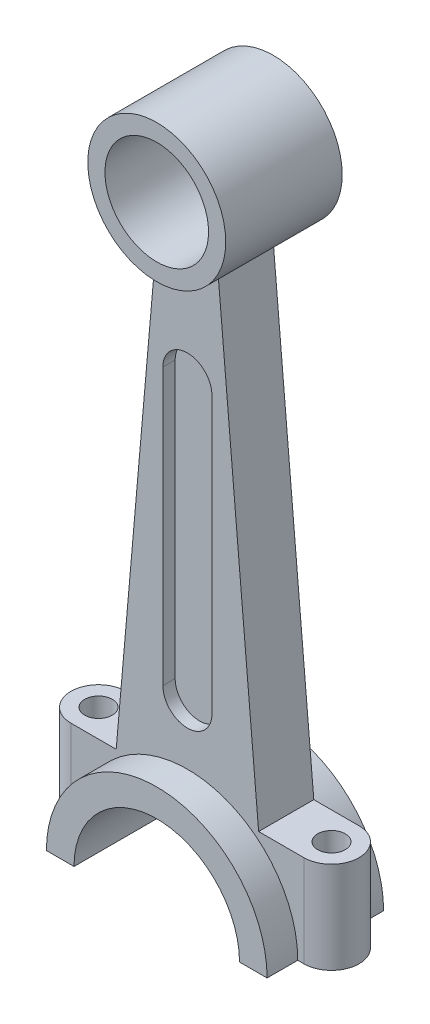
ISO-10303-21;
HEADER;
FILE_DESCRIPTION(('STEP AP214'),'2;1');
FILE_NAME('part.step','',(''),(''),'','','');
FILE_SCHEMA(('AUTOMOTIVE_DESIGN { 1 0 10303 214 1 1 1 1 }'));
ENDSEC;
DATA;
#1=APPLICATION_CONTEXT('core data for automotive mechanical design processes');
#2=APPLICATION_PROTOCOL_DEFINITION('international standard','automotive_design',2000,#1);
#3=PRODUCT_CONTEXT('',#1,'mechanical');
#4=PRODUCT('Part','Part','',(#3));
#5=PRODUCT_RELATED_PRODUCT_CATEGORY('part','',(#4));
#6=PRODUCT_DEFINITION_FORMATION('','',#4);
#7=PRODUCT_DEFINITION_CONTEXT('part definition',#1,'design');
#8=PRODUCT_DEFINITION('design','',#6,#7);
#9=PRODUCT_DEFINITION_SHAPE('','',#8);
#10=(LENGTH_UNIT() NAMED_UNIT(*) SI_UNIT(.MILLI.,.METRE.));
#11=(NAMED_UNIT(*) PLANE_ANGLE_UNIT() SI_UNIT($,.RADIAN.));
#12=(NAMED_UNIT(*) SI_UNIT($,.STERADIAN.) SOLID_ANGLE_UNIT());
#13=UNCERTAINTY_MEASURE_WITH_UNIT(LENGTH_MEASURE(1.E-05),#10,'distance_accuracy_value','');
#14=(GEOMETRIC_REPRESENTATION_CONTEXT(3) GLOBAL_UNCERTAINTY_ASSIGNED_CONTEXT((#13)) GLOBAL_UNIT_ASSIGNED_CONTEXT((#10,
#11,#12)) REPRESENTATION_CONTEXT('',''));
#15=CARTESIAN_POINT('',(0.,0.,0.));
#16=DIRECTION('',(0.,0.,1.));
#17=DIRECTION('',(1.,0.,0.));
#18=AXIS2_PLACEMENT_3D('',#15,#16,#17);
#19=CARTESIAN_POINT('',(0.,-201.2,-80.));
#20=DIRECTION('',(0.,1.,0.));
#21=DIRECTION('',(0.,0.,1.));
#22=AXIS2_PLACEMENT_3D('',#19,#20,#21);
#23=PLANE('',#22);
#24=CARTESIAN_POINT('',(-38.,-201.2,0.));
#25=DIRECTION('',(0.,1.,0.));
#26=DIRECTION('',(0.,0.,1.));
#27=AXIS2_PLACEMENT_3D('',#24,#25,#26);
#28=CIRCLE('',#27,4.5);
#29=CARTESIAN_POINT('',(-38.,-201.2,4.50000000000001));
#30=VERTEX_POINT('',#29);
#31=EDGE_CURVE('E745',#30,#30,#28,.F.);
#32=ORIENTED_EDGE('',*,*,#31,.F.);
#33=EDGE_LOOP('',(#32));
#34=FACE_BOUND('',#33,.T.);
#35=DIRECTION('',(0.,0.,-1.));
#36=VECTOR('',#35,1.);
#37=CARTESIAN_POINT('',(-27.,-201.2,19.));
#38=LINE('',#37,#36);
#39=CARTESIAN_POINT('',(-27.,-201.2,-19.));
#40=VERTEX_POINT('',#39);
#41=CARTESIAN_POINT('',(-27.,-201.2,19.));
#42=VERTEX_POINT('',#41);
#43=EDGE_CURVE('E268',#40,#42,#38,.F.);
#44=ORIENTED_EDGE('',*,*,#43,.T.);
#45=DIRECTION('',(-1.,0.,0.));
#46=VECTOR('',#45,1.);
#47=CARTESIAN_POINT('',(0.,-201.2,19.));
#48=LINE('',#47,#46);
#49=CARTESIAN_POINT('',(-36.,-201.2,19.));
#50=VERTEX_POINT('',#49);
#51=EDGE_CURVE('E259',#42,#50,#48,.T.);
#52=ORIENTED_EDGE('',*,*,#51,.T.);
#53=DIRECTION('',(0.,0.,-1.));
#54=VECTOR('',#53,1.);
#55=CARTESIAN_POINT('',(-36.,-201.2,19.));
#56=LINE('',#55,#54);
#57=CARTESIAN_POINT('',(-36.,-201.2,8.99999999999997));
#58=VERTEX_POINT('',#57);
#59=EDGE_CURVE('E269',#58,#50,#56,.F.);
#60=ORIENTED_EDGE('',*,*,#59,.F.);
#61=DIRECTION('',(1.,0.,0.));
#62=VECTOR('',#61,1.);
#63=CARTESIAN_POINT('',(-38.,-201.2,8.99999999999997));
#64=LINE('',#63,#62);
#65=CARTESIAN_POINT('',(-38.,-201.2,8.99999999999997));
#66=VERTEX_POINT('',#65);
#67=EDGE_CURVE('E250',#66,#58,#64,.T.);
#68=ORIENTED_EDGE('',*,*,#67,.F.);
#69=CARTESIAN_POINT('',(-38.,-201.2,0.));
#70=DIRECTION('',(0.,1.,0.));
#71=DIRECTION('',(0.,0.,1.));
#72=AXIS2_PLACEMENT_3D('',#69,#70,#71);
#73=CIRCLE('',#72,8.99999999999999);
#74=CARTESIAN_POINT('',(-38.,-201.2,-9.));
#75=VERTEX_POINT('',#74);
#76=EDGE_CURVE('E231',#75,#66,#73,.T.);
#77=ORIENTED_EDGE('',*,*,#76,.F.);
#78=DIRECTION('',(-1.,0.,0.));
#79=VECTOR('',#78,1.);
#80=CARTESIAN_POINT('',(-38.,-201.2,-9.));
#81=LINE('',#80,#79);
#82=CARTESIAN_POINT('',(-36.,-201.2,-9.00000000000001));
#83=VERTEX_POINT('',#82);
#84=EDGE_CURVE('E199',#83,#75,#81,.T.);
#85=ORIENTED_EDGE('',*,*,#84,.F.);
#86=CARTESIAN_POINT('',(-36.,-201.2,-19.));
#87=VERTEX_POINT('',#86);
#88=EDGE_CURVE('E264',#87,#83,#56,.F.);
#89=ORIENTED_EDGE('',*,*,#88,.F.);
#90=DIRECTION('',(-1.,0.,0.));
#91=VECTOR('',#90,1.);
#92=CARTESIAN_POINT('',(0.,-201.2,-19.));
#93=LINE('',#92,#91);
#94=EDGE_CURVE('E45',#40,#87,#93,.T.);
#95=ORIENTED_EDGE('',*,*,#94,.F.);
#96=EDGE_LOOP('',(#44,#52,#60,#68,#77,#85,#89,#95));
#97=FACE_BOUND('',#96,.T.);
#98=ADVANCED_FACE('F41',(#34,#97),#23,.F.);
#99=CARTESIAN_POINT('',(8.17146237229209,0.715894802816536,9.));
#100=DIRECTION('',(0.996184270499604,0.0872748486631294,0.));
#101=DIRECTION('',(-0.0872748486631294,0.996184270499604,0.));
#102=AXIS2_PLACEMENT_3D('',#99,#100,#101);
#103=PLANE('',#102);
#104=DIRECTION('',(0.0872748486631294,-0.996184270499604,0.));
#105=VECTOR('',#104,1.);
#106=CARTESIAN_POINT('',(8.17146237229209,0.715894802816536,9.));
#107=LINE('',#106,#105);
#108=CARTESIAN_POINT('',(10.,-20.1556443707464,9.));
#109=VERTEX_POINT('',#108);
#110=CARTESIAN_POINT('',(23.2328663173449,-171.2,9.));
#111=VERTEX_POINT('',#110);
#112=EDGE_CURVE('E387',#109,#111,#107,.T.);
#113=ORIENTED_EDGE('',*,*,#112,.T.);
#114=DIRECTION('',(0.,0.,-1.));
#115=VECTOR('',#114,1.);
#116=CARTESIAN_POINT('',(23.2328663173449,-171.2,9.));
#117=LINE('',#116,#115);
#118=CARTESIAN_POINT('',(23.2328663173449,-171.2,-9.));
#119=VERTEX_POINT('',#118);
#120=EDGE_CURVE('E57',#111,#119,#117,.T.);
#121=ORIENTED_EDGE('',*,*,#120,.T.);
#122=DIRECTION('',(0.0872748486631294,-0.996184270499604,0.));
#123=VECTOR('',#122,1.);
#124=CARTESIAN_POINT('',(8.17146237229209,0.715894802816536,-9.));
#125=LINE('',#124,#123);
#126=CARTESIAN_POINT('',(10.,-20.1556443707464,-9.));
#127=VERTEX_POINT('',#126);
#128=EDGE_CURVE('E400',#127,#119,#125,.T.);
#129=ORIENTED_EDGE('',*,*,#128,.F.);
#130=DIRECTION('',(0.,0.,-1.));
#131=VECTOR('',#130,1.);
#132=CARTESIAN_POINT('',(10.,-20.1556443707464,9.));
#133=LINE('',#132,#131);
#134=EDGE_CURVE('E411',#109,#127,#133,.T.);
#135=ORIENTED_EDGE('',*,*,#134,.F.);
#136=EDGE_LOOP('',(#113,#121,#129,#135));
#137=FACE_BOUND('',#136,.T.);
#138=ADVANCED_FACE('F445',(#137),#103,.T.);
#139=CARTESIAN_POINT('',(-8.17146237229209,0.715894802816535,9.));
#140=DIRECTION('',(0.996184270499604,-0.0872748486631293,0.));
#141=DIRECTION('',(0.0872748486631293,0.996184270499604,0.));
#142=AXIS2_PLACEMENT_3D('',#139,#140,#141);
#143=PLANE('',#142);
#144=DIRECTION('',(0.,0.,-1.));
#145=VECTOR('',#144,1.);
#146=CARTESIAN_POINT('',(-23.2328663173449,-171.2,9.));
#147=LINE('',#146,#145);
#148=CARTESIAN_POINT('',(-23.2328663173449,-171.2,9.));
#149=VERTEX_POINT('',#148);
#150=CARTESIAN_POINT('',(-23.2328663173449,-171.2,-9.));
#151=VERTEX_POINT('',#150);
#152=EDGE_CURVE('E213',#149,#151,#147,.T.);
#153=ORIENTED_EDGE('',*,*,#152,.F.);
#154=DIRECTION('',(-0.0872748486631293,-0.996184270499604,0.));
#155=VECTOR('',#154,1.);
#156=CARTESIAN_POINT('',(-8.17146237229209,0.715894802816535,9.));
#157=LINE('',#156,#155);
#158=CARTESIAN_POINT('',(-10.,-20.1556443707464,9.));
#159=VERTEX_POINT('',#158);
#160=EDGE_CURVE('E393',#159,#149,#157,.T.);
#161=ORIENTED_EDGE('',*,*,#160,.F.);
#162=DIRECTION('',(0.,0.,-1.));
#163=VECTOR('',#162,1.);
#164=CARTESIAN_POINT('',(-10.,-20.1556443707464,9.));
#165=LINE('',#164,#163);
#166=CARTESIAN_POINT('',(-10.,-20.1556443707464,-9.));
#167=VERTEX_POINT('',#166);
#168=EDGE_CURVE('E397',#159,#167,#165,.T.);
#169=ORIENTED_EDGE('',*,*,#168,.T.);
#170=DIRECTION('',(-0.0872748486631293,-0.996184270499604,0.));
#171=VECTOR('',#170,1.);
#172=CARTESIAN_POINT('',(-8.17146237229209,0.715894802816535,-9.));
#173=LINE('',#172,#171);
#174=EDGE_CURVE('E65',#167,#151,#173,.T.);
#175=ORIENTED_EDGE('',*,*,#174,.T.);
#176=EDGE_LOOP('',(#153,#161,#169,#175));
#177=FACE_BOUND('',#176,.T.);
#178=ADVANCED_FACE('F452',(#177),#143,.F.);
#179=CARTESIAN_POINT('',(0.,-201.2,19.));
#180=DIRECTION('',(0.,0.,-1.));
#181=DIRECTION('',(-1.,0.,0.));
#182=AXIS2_PLACEMENT_3D('',#179,#180,#181);
#183=CYLINDRICAL_SURFACE('',#182,27.);
#184=CARTESIAN_POINT('',(0.,-201.2,-19.));
#185=DIRECTION('',(0.,0.,1.));
#186=DIRECTION('',(1.,0.,0.));
#187=AXIS2_PLACEMENT_3D('',#184,#185,#186);
#188=CIRCLE('',#187,27.);
#189=CARTESIAN_POINT('',(27.,-201.2,-19.));
#190=VERTEX_POINT('',#189);
#191=EDGE_CURVE('E358',#190,#40,#188,.T.);
#192=ORIENTED_EDGE('',*,*,#191,.F.);
#193=DIRECTION('',(0.,0.,-1.));
#194=VECTOR('',#193,1.);
#195=CARTESIAN_POINT('',(27.,-201.2,19.));
#196=LINE('',#195,#194);
#197=CARTESIAN_POINT('',(27.,-201.2,19.));
#198=VERTEX_POINT('',#197);
#199=EDGE_CURVE('E277',#198,#190,#196,.T.);
#200=ORIENTED_EDGE('',*,*,#199,.F.);
#201=CARTESIAN_POINT('',(0.,-201.2,19.));
#202=DIRECTION('',(0.,0.,1.));
#203=DIRECTION('',(1.,0.,0.));
#204=AXIS2_PLACEMENT_3D('',#201,#202,#203);
#205=CIRCLE('',#204,27.);
#206=EDGE_CURVE('E368',#198,#42,#205,.T.);
#207=ORIENTED_EDGE('',*,*,#206,.T.);
#208=ORIENTED_EDGE('',*,*,#43,.F.);
#209=EDGE_LOOP('',(#192,#200,#207,#208));
#210=FACE_BOUND('',#209,.T.);
#211=ADVANCED_FACE('F481',(#210),#183,.F.);
#212=CARTESIAN_POINT('',(0.,-201.2,19.));
#213=DIRECTION('',(0.,0.,-1.));
#214=DIRECTION('',(-1.,0.,0.));
#215=AXIS2_PLACEMENT_3D('',#212,#213,#214);
#216=CYLINDRICAL_SURFACE('',#215,36.);
#217=CARTESIAN_POINT('',(0.,-201.2,9.));
#218=DIRECTION('',(0.,0.,1.));
#219=DIRECTION('',(1.,0.,0.));
#220=AXIS2_PLACEMENT_3D('',#217,#218,#219);
#221=CIRCLE('',#220,36.);
#222=CARTESIAN_POINT('',(36.,-201.2,9.00000000000001));
#223=VERTEX_POINT('',#222);
#224=EDGE_CURVE('E384',#223,#58,#221,.T.);
#225=ORIENTED_EDGE('',*,*,#224,.T.);
#226=ORIENTED_EDGE('',*,*,#59,.T.);
#227=CARTESIAN_POINT('',(0.,-201.2,19.));
#228=DIRECTION('',(0.,0.,1.));
#229=DIRECTION('',(1.,0.,0.));
#230=AXIS2_PLACEMENT_3D('',#227,#228,#229);
#231=CIRCLE('',#230,36.);
#232=CARTESIAN_POINT('',(36.,-201.2,19.));
#233=VERTEX_POINT('',#232);
#234=EDGE_CURVE('E372',#233,#50,#231,.T.);
#235=ORIENTED_EDGE('',*,*,#234,.F.);
#236=DIRECTION('',(0.,0.,-1.));
#237=VECTOR('',#236,1.);
#238=CARTESIAN_POINT('',(36.,-201.2,19.));
#239=LINE('',#238,#237);
#240=EDGE_CURVE('E273',#233,#223,#239,.T.);
#241=ORIENTED_EDGE('',*,*,#240,.T.);
#242=EDGE_LOOP('',(#225,#226,#235,#241));
#243=FACE_BOUND('',#242,.T.);
#244=ADVANCED_FACE('F488',(#243),#216,.T.);
#245=CARTESIAN_POINT('',(0.,-201.2,-9.));
#246=DIRECTION('',(0.,0.,1.));
#247=DIRECTION('',(1.,0.,0.));
#248=AXIS2_PLACEMENT_3D('',#245,#246,#247);
#249=CIRCLE('',#248,36.);
#250=CARTESIAN_POINT('',(36.,-201.2,-8.99999999999998));
#251=VERTEX_POINT('',#250);
#252=EDGE_CURVE('E377',#251,#83,#249,.T.);
#253=ORIENTED_EDGE('',*,*,#252,.F.);
#254=CARTESIAN_POINT('',(36.,-201.2,-19.));
#255=VERTEX_POINT('',#254);
#256=EDGE_CURVE('E272',#251,#255,#239,.T.);
#257=ORIENTED_EDGE('',*,*,#256,.T.);
#258=CARTESIAN_POINT('',(0.,-201.2,-19.));
#259=DIRECTION('',(0.,0.,1.));
#260=DIRECTION('',(1.,0.,0.));
#261=AXIS2_PLACEMENT_3D('',#258,#259,#260);
#262=CIRCLE('',#261,36.);
#263=EDGE_CURVE('E373',#255,#87,#262,.T.);
#264=ORIENTED_EDGE('',*,*,#263,.T.);
#265=ORIENTED_EDGE('',*,*,#88,.T.);
#266=EDGE_LOOP('',(#253,#257,#264,#265));
#267=FACE_BOUND('',#266,.T.);
#268=ADVANCED_FACE('F522',(#267),#216,.T.);
#269=CARTESIAN_POINT('',(0.,0.,-9.));
#270=DIRECTION('',(0.,0.,1.));
#271=DIRECTION('',(1.,0.,0.));
#272=AXIS2_PLACEMENT_3D('',#269,#270,#271);
#273=PLANE('',#272);
#274=ORIENTED_EDGE('',*,*,#252,.T.);
#275=ORIENTED_EDGE('',*,*,#84,.T.);
#276=DIRECTION('',(0.,1.,0.));
#277=VECTOR('',#276,1.);
#278=CARTESIAN_POINT('',(-38.,-296.907888912043,-9.));
#279=LINE('',#278,#277);
#280=CARTESIAN_POINT('',(-38.,-171.2,-9.));
#281=VERTEX_POINT('',#280);
#282=EDGE_CURVE('E193',#75,#281,#279,.T.);
#283=ORIENTED_EDGE('',*,*,#282,.T.);
#284=DIRECTION('',(1.,0.,0.));
#285=VECTOR('',#284,1.);
#286=CARTESIAN_POINT('',(-38.,-171.2,-9.));
#287=LINE('',#286,#285);
#288=EDGE_CURVE('E197',#281,#151,#287,.T.);
#289=ORIENTED_EDGE('',*,*,#288,.T.);
#290=ORIENTED_EDGE('',*,*,#174,.F.);
#291=CARTESIAN_POINT('',(0.,0.,-9.));
#292=DIRECTION('',(0.,0.,1.));
#293=DIRECTION('',(1.,0.,0.));
#294=AXIS2_PLACEMENT_3D('',#291,#292,#293);
#295=CIRCLE('',#294,22.5);
#296=EDGE_CURVE('E403',#167,#127,#295,.T.);
#297=ORIENTED_EDGE('',*,*,#296,.T.);
#298=ORIENTED_EDGE('',*,*,#128,.T.);
#299=CARTESIAN_POINT('',(38.,-171.2,-8.99999999999998));
#300=VERTEX_POINT('',#299);
#301=EDGE_CURVE('E216',#119,#300,#287,.T.);
#302=ORIENTED_EDGE('',*,*,#301,.T.);
#303=DIRECTION('',(0.,1.,0.));
#304=VECTOR('',#303,1.);
#305=CARTESIAN_POINT('',(38.,-296.907888912043,-8.99999999999998));
#306=LINE('',#305,#304);
#307=CARTESIAN_POINT('',(38.,-201.2,-8.99999999999998));
#308=VERTEX_POINT('',#307);
#309=EDGE_CURVE('E206',#308,#300,#306,.T.);
#310=ORIENTED_EDGE('',*,*,#309,.F.);
#311=EDGE_CURVE('E494',#308,#251,#81,.T.);
#312=ORIENTED_EDGE('',*,*,#311,.T.);
#313=EDGE_LOOP('',(#274,#275,#283,#289,#290,#297,#298,#302,#310,#312));
#314=FACE_BOUND('',#313,.T.);
#315=CARTESIAN_POINT('',(0.,-55.6,-9.));
#316=DIRECTION('',(0.,0.,1.));
#317=DIRECTION('',(1.,0.,0.));
#318=AXIS2_PLACEMENT_3D('',#315,#316,#317);
#319=CIRCLE('',#318,7.99999999999998);
#320=CARTESIAN_POINT('',(7.99999999999997,-55.6,-9.));
#321=VERTEX_POINT('',#320);
#322=CARTESIAN_POINT('',(-7.99999999999999,-55.6,-9.));
#323=VERTEX_POINT('',#322);
#324=EDGE_CURVE('E280',#321,#323,#319,.T.);
#325=ORIENTED_EDGE('',*,*,#324,.T.);
#326=DIRECTION('',(0.,-1.,0.));
#327=VECTOR('',#326,1.);
#328=CARTESIAN_POINT('',(-7.99999999999999,-55.6,-9.));
#329=LINE('',#328,#327);
#330=CARTESIAN_POINT('',(-7.99999999999997,-145.6,-9.));
#331=VERTEX_POINT('',#330);
#332=EDGE_CURVE('E286',#323,#331,#329,.T.);
#333=ORIENTED_EDGE('',*,*,#332,.T.);
#334=CARTESIAN_POINT('',(0.,-145.6,-9.));
#335=DIRECTION('',(0.,0.,1.));
#336=DIRECTION('',(1.,0.,0.));
#337=AXIS2_PLACEMENT_3D('',#334,#335,#336);
#338=CIRCLE('',#337,7.99999999999998);
#339=CARTESIAN_POINT('',(8.,-145.6,-9.));
#340=VERTEX_POINT('',#339);
#341=EDGE_CURVE('E303',#331,#340,#338,.T.);
#342=ORIENTED_EDGE('',*,*,#341,.T.);
#343=DIRECTION('',(0.,1.,0.));
#344=VECTOR('',#343,1.);
#345=CARTESIAN_POINT('',(7.99999999999997,-55.6,-9.));
#346=LINE('',#345,#344);
#347=EDGE_CURVE('E299',#340,#321,#346,.T.);
#348=ORIENTED_EDGE('',*,*,#347,.T.);
#349=EDGE_LOOP('',(#325,#333,#342,#348));
#350=FACE_BOUND('',#349,.T.);
#351=ADVANCED_FACE('F195',(#314,#350),#273,.F.);
#352=CARTESIAN_POINT('',(0.,0.,19.));
#353=DIRECTION('',(0.,0.,-1.));
#354=DIRECTION('',(-1.,0.,0.));
#355=AXIS2_PLACEMENT_3D('',#352,#353,#354);
#356=CYLINDRICAL_SURFACE('',#355,22.5);
#357=ORIENTED_EDGE('',*,*,#168,.F.);
#358=CARTESIAN_POINT('',(0.,0.,9.));
#359=DIRECTION('',(0.,0.,1.));
#360=DIRECTION('',(1.,0.,0.));
#361=AXIS2_PLACEMENT_3D('',#358,#359,#360);
#362=CIRCLE('',#361,22.5);
#363=EDGE_CURVE('E390',#159,#109,#362,.T.);
#364=ORIENTED_EDGE('',*,*,#363,.T.);
#365=ORIENTED_EDGE('',*,*,#134,.T.);
#366=ORIENTED_EDGE('',*,*,#296,.F.);
#367=EDGE_LOOP('',(#357,#364,#365,#366));
#368=FACE_BOUND('',#367,.T.);
#369=CARTESIAN_POINT('',(0.,0.,19.));
#370=DIRECTION('',(0.,0.,1.));
#371=DIRECTION('',(1.,0.,0.));
#372=AXIS2_PLACEMENT_3D('',#369,#370,#371);
#373=CIRCLE('',#372,22.5);
#374=CARTESIAN_POINT('',(22.5,0.,19.));
#375=VERTEX_POINT('',#374);
#376=EDGE_CURVE('E415',#375,#375,#373,.T.);
#377=ORIENTED_EDGE('',*,*,#376,.F.);
#378=EDGE_LOOP('',(#377));
#379=FACE_BOUND('',#378,.T.);
#380=CARTESIAN_POINT('',(0.,0.,-19.));
#381=DIRECTION('',(0.,0.,1.));
#382=DIRECTION('',(1.,0.,0.));
#383=AXIS2_PLACEMENT_3D('',#380,#381,#382);
#384=CIRCLE('',#383,22.5);
#385=CARTESIAN_POINT('',(22.5,0.,-19.));
#386=VERTEX_POINT('',#385);
#387=EDGE_CURVE('E414',#386,#386,#384,.T.);
#388=ORIENTED_EDGE('',*,*,#387,.T.);
#389=EDGE_LOOP('',(#388));
#390=FACE_BOUND('',#389,.T.);
#391=ADVANCED_FACE('F43',(#368,#379,#390),#356,.T.);
#392=CARTESIAN_POINT('',(0.,0.,19.));
#393=DIRECTION('',(0.,0.,-1.));
#394=DIRECTION('',(-1.,0.,0.));
#395=AXIS2_PLACEMENT_3D('',#392,#393,#394);
#396=CYLINDRICAL_SURFACE('',#395,16.9);
#397=CARTESIAN_POINT('',(0.,0.,19.));
#398=DIRECTION('',(0.,0.,1.));
#399=DIRECTION('',(1.,0.,0.));
#400=AXIS2_PLACEMENT_3D('',#397,#398,#399);
#401=CIRCLE('',#400,16.9);
#402=CARTESIAN_POINT('',(16.9,0.,19.));
#403=VERTEX_POINT('',#402);
#404=EDGE_CURVE('E419',#403,#403,#401,.T.);
#405=ORIENTED_EDGE('',*,*,#404,.T.);
#406=EDGE_LOOP('',(#405));
#407=FACE_BOUND('',#406,.T.);
#408=CARTESIAN_POINT('',(0.,0.,-19.));
#409=DIRECTION('',(0.,0.,1.));
#410=DIRECTION('',(1.,0.,0.));
#411=AXIS2_PLACEMENT_3D('',#408,#409,#410);
#412=CIRCLE('',#411,16.9);
#413=CARTESIAN_POINT('',(16.9,0.,-19.));
#414=VERTEX_POINT('',#413);
#415=EDGE_CURVE('E420',#414,#414,#412,.T.);
#416=ORIENTED_EDGE('',*,*,#415,.F.);
#417=EDGE_LOOP('',(#416));
#418=FACE_BOUND('',#417,.T.);
#419=ADVANCED_FACE('F432',(#407,#418),#396,.F.);
#420=CARTESIAN_POINT('',(0.,0.,19.));
#421=DIRECTION('',(0.,0.,1.));
#422=DIRECTION('',(1.,0.,0.));
#423=AXIS2_PLACEMENT_3D('',#420,#421,#422);
#424=PLANE('',#423);
#425=ORIENTED_EDGE('',*,*,#376,.T.);
#426=EDGE_LOOP('',(#425));
#427=FACE_BOUND('',#426,.T.);
#428=ORIENTED_EDGE('',*,*,#404,.F.);
#429=EDGE_LOOP('',(#428));
#430=FACE_BOUND('',#429,.T.);
#431=ADVANCED_FACE('F434',(#427,#430),#424,.T.);
#432=CARTESIAN_POINT('',(0.,0.,-19.));
#433=DIRECTION('',(0.,0.,1.));
#434=DIRECTION('',(1.,0.,0.));
#435=AXIS2_PLACEMENT_3D('',#432,#433,#434);
#436=PLANE('',#435);
#437=ORIENTED_EDGE('',*,*,#387,.F.);
#438=EDGE_LOOP('',(#437));
#439=FACE_BOUND('',#438,.T.);
#440=ORIENTED_EDGE('',*,*,#415,.T.);
#441=EDGE_LOOP('',(#440));
#442=FACE_BOUND('',#441,.T.);
#443=ADVANCED_FACE('F430',(#439,#442),#436,.F.);
#444=CARTESIAN_POINT('',(0.,0.,9.));
#445=DIRECTION('',(0.,0.,1.));
#446=DIRECTION('',(1.,0.,0.));
#447=AXIS2_PLACEMENT_3D('',#444,#445,#446);
#448=PLANE('',#447);
#449=ORIENTED_EDGE('',*,*,#224,.F.);
#450=CARTESIAN_POINT('',(38.,-201.2,9.));
#451=VERTEX_POINT('',#450);
#452=EDGE_CURVE('E205',#223,#451,#64,.T.);
#453=ORIENTED_EDGE('',*,*,#452,.T.);
#454=DIRECTION('',(0.,1.,0.));
#455=VECTOR('',#454,1.);
#456=CARTESIAN_POINT('',(38.,-296.907888912043,9.));
#457=LINE('',#456,#455);
#458=CARTESIAN_POINT('',(38.,-171.2,9.));
#459=VERTEX_POINT('',#458);
#460=EDGE_CURVE('E244',#451,#459,#457,.T.);
#461=ORIENTED_EDGE('',*,*,#460,.T.);
#462=DIRECTION('',(-1.,0.,0.));
#463=VECTOR('',#462,1.);
#464=CARTESIAN_POINT('',(-38.,-171.2,8.99999999999997));
#465=LINE('',#464,#463);
#466=EDGE_CURVE('E238',#459,#111,#465,.T.);
#467=ORIENTED_EDGE('',*,*,#466,.T.);
#468=ORIENTED_EDGE('',*,*,#112,.F.);
#469=ORIENTED_EDGE('',*,*,#363,.F.);
#470=ORIENTED_EDGE('',*,*,#160,.T.);
#471=CARTESIAN_POINT('',(-38.,-171.2,8.99999999999997));
#472=VERTEX_POINT('',#471);
#473=EDGE_CURVE('E237',#149,#472,#465,.T.);
#474=ORIENTED_EDGE('',*,*,#473,.T.);
#475=DIRECTION('',(0.,1.,0.));
#476=VECTOR('',#475,1.);
#477=CARTESIAN_POINT('',(-38.,-296.907888912043,8.99999999999997));
#478=LINE('',#477,#476);
#479=EDGE_CURVE('E221',#66,#472,#478,.T.);
#480=ORIENTED_EDGE('',*,*,#479,.F.);
#481=ORIENTED_EDGE('',*,*,#67,.T.);
#482=EDGE_LOOP('',(#449,#453,#461,#467,#468,#469,#470,#474,#480,#481));
#483=FACE_BOUND('',#482,.T.);
#484=CARTESIAN_POINT('',(0.,-55.6,9.));
#485=DIRECTION('',(0.,0.,1.));
#486=DIRECTION('',(1.,0.,0.));
#487=AXIS2_PLACEMENT_3D('',#484,#485,#486);
#488=CIRCLE('',#487,7.99999999999998);
#489=CARTESIAN_POINT('',(7.99999999999997,-55.6,9.));
#490=VERTEX_POINT('',#489);
#491=CARTESIAN_POINT('',(-7.99999999999999,-55.6,9.));
#492=VERTEX_POINT('',#491);
#493=EDGE_CURVE('E314',#490,#492,#488,.T.);
#494=ORIENTED_EDGE('',*,*,#493,.F.);
#495=DIRECTION('',(0.,1.,0.));
#496=VECTOR('',#495,1.);
#497=CARTESIAN_POINT('',(7.99999999999997,-55.6,9.));
#498=LINE('',#497,#496);
#499=CARTESIAN_POINT('',(8.,-145.6,9.));
#500=VERTEX_POINT('',#499);
#501=EDGE_CURVE('E329',#500,#490,#498,.T.);
#502=ORIENTED_EDGE('',*,*,#501,.F.);
#503=CARTESIAN_POINT('',(0.,-145.6,9.));
#504=DIRECTION('',(0.,0.,1.));
#505=DIRECTION('',(1.,0.,0.));
#506=AXIS2_PLACEMENT_3D('',#503,#504,#505);
#507=CIRCLE('',#506,7.99999999999998);
#508=CARTESIAN_POINT('',(-7.99999999999997,-145.6,9.));
#509=VERTEX_POINT('',#508);
#510=EDGE_CURVE('E348',#509,#500,#507,.T.);
#511=ORIENTED_EDGE('',*,*,#510,.F.);
#512=DIRECTION('',(0.,-1.,0.));
#513=VECTOR('',#512,1.);
#514=CARTESIAN_POINT('',(-7.99999999999999,-55.6,9.));
#515=LINE('',#514,#513);
#516=EDGE_CURVE('E344',#492,#509,#515,.T.);
#517=ORIENTED_EDGE('',*,*,#516,.F.);
#518=EDGE_LOOP('',(#494,#502,#511,#517));
#519=FACE_BOUND('',#518,.T.);
#520=ADVANCED_FACE('F503',(#483,#519),#448,.T.);
#521=CARTESIAN_POINT('',(0.,0.,19.));
#522=DIRECTION('',(0.,0.,1.));
#523=DIRECTION('',(1.,0.,0.));
#524=AXIS2_PLACEMENT_3D('',#521,#522,#523);
#525=PLANE('',#524);
#526=EDGE_CURVE('E263',#233,#198,#48,.T.);
#527=ORIENTED_EDGE('',*,*,#526,.F.);
#528=ORIENTED_EDGE('',*,*,#234,.T.);
#529=ORIENTED_EDGE('',*,*,#51,.F.);
#530=ORIENTED_EDGE('',*,*,#206,.F.);
#531=EDGE_LOOP('',(#527,#528,#529,#530));
#532=FACE_BOUND('',#531,.T.);
#533=ADVANCED_FACE('F485',(#532),#525,.T.);
#534=CARTESIAN_POINT('',(0.,0.,-19.));
#535=DIRECTION('',(0.,0.,1.));
#536=DIRECTION('',(1.,0.,0.));
#537=AXIS2_PLACEMENT_3D('',#534,#535,#536);
#538=PLANE('',#537);
#539=ORIENTED_EDGE('',*,*,#263,.F.);
#540=EDGE_CURVE('E11',#255,#190,#93,.T.);
#541=ORIENTED_EDGE('',*,*,#540,.T.);
#542=ORIENTED_EDGE('',*,*,#191,.T.);
#543=ORIENTED_EDGE('',*,*,#94,.T.);
#544=EDGE_LOOP('',(#539,#541,#542,#543));
#545=FACE_BOUND('',#544,.T.);
#546=ADVANCED_FACE('F478',(#545),#538,.F.);
#547=CARTESIAN_POINT('',(0.,-55.6,5.));
#548=DIRECTION('',(0.,0.,1.));
#549=DIRECTION('',(1.,0.,0.));
#550=AXIS2_PLACEMENT_3D('',#547,#548,#549);
#551=CYLINDRICAL_SURFACE('',#550,7.99999999999998);
#552=ORIENTED_EDGE('',*,*,#493,.T.);
#553=DIRECTION('',(0.,0.,1.));
#554=VECTOR('',#553,1.);
#555=CARTESIAN_POINT('',(-7.99999999999999,-55.6,5.));
#556=LINE('',#555,#554);
#557=CARTESIAN_POINT('',(-7.99999999999999,-55.6,5.));
#558=VERTEX_POINT('',#557);
#559=EDGE_CURVE('E341',#558,#492,#556,.T.);
#560=ORIENTED_EDGE('',*,*,#559,.F.);
#561=CARTESIAN_POINT('',(0.,-55.6,5.));
#562=DIRECTION('',(0.,0.,1.));
#563=DIRECTION('',(1.,0.,0.));
#564=AXIS2_PLACEMENT_3D('',#561,#562,#563);
#565=CIRCLE('',#564,7.99999999999998);
#566=CARTESIAN_POINT('',(7.99999999999997,-55.6,5.));
#567=VERTEX_POINT('',#566);
#568=EDGE_CURVE('E324',#567,#558,#565,.T.);
#569=ORIENTED_EDGE('',*,*,#568,.F.);
#570=DIRECTION('',(0.,0.,1.));
#571=VECTOR('',#570,1.);
#572=CARTESIAN_POINT('',(7.99999999999997,-55.6,5.));
#573=LINE('',#572,#571);
#574=EDGE_CURVE('E355',#567,#490,#573,.T.);
#575=ORIENTED_EDGE('',*,*,#574,.T.);
#576=EDGE_LOOP('',(#552,#560,#569,#575));
#577=FACE_BOUND('',#576,.T.);
#578=ADVANCED_FACE('F566',(#577),#551,.F.);
#579=CARTESIAN_POINT('',(7.99999999999997,-55.6,5.));
#580=DIRECTION('',(1.,0.,0.));
#581=DIRECTION('',(0.,1.,0.));
#582=AXIS2_PLACEMENT_3D('',#579,#580,#581);
#583=PLANE('',#582);
#584=ORIENTED_EDGE('',*,*,#501,.T.);
#585=ORIENTED_EDGE('',*,*,#574,.F.);
#586=DIRECTION('',(0.,1.,0.));
#587=VECTOR('',#586,1.);
#588=CARTESIAN_POINT('',(7.99999999999997,-55.6,5.));
#589=LINE('',#588,#587);
#590=CARTESIAN_POINT('',(8.,-145.6,5.));
#591=VERTEX_POINT('',#590);
#592=EDGE_CURVE('E337',#591,#567,#589,.T.);
#593=ORIENTED_EDGE('',*,*,#592,.F.);
#594=DIRECTION('',(0.,0.,1.));
#595=VECTOR('',#594,1.);
#596=CARTESIAN_POINT('',(8.,-145.6,5.));
#597=LINE('',#596,#595);
#598=EDGE_CURVE('E359',#591,#500,#597,.T.);
#599=ORIENTED_EDGE('',*,*,#598,.T.);
#600=EDGE_LOOP('',(#584,#585,#593,#599));
#601=FACE_BOUND('',#600,.T.);
#602=ADVANCED_FACE('F573',(#601),#583,.F.);
#603=CARTESIAN_POINT('',(0.,-145.6,5.));
#604=DIRECTION('',(0.,0.,1.));
#605=DIRECTION('',(1.,0.,0.));
#606=AXIS2_PLACEMENT_3D('',#603,#604,#605);
#607=CYLINDRICAL_SURFACE('',#606,7.99999999999998);
#608=ORIENTED_EDGE('',*,*,#510,.T.);
#609=ORIENTED_EDGE('',*,*,#598,.F.);
#610=CARTESIAN_POINT('',(0.,-145.6,5.));
#611=DIRECTION('',(0.,0.,1.));
#612=DIRECTION('',(1.,0.,0.));
#613=AXIS2_PLACEMENT_3D('',#610,#611,#612);
#614=CIRCLE('',#613,7.99999999999998);
#615=CARTESIAN_POINT('',(-7.99999999999997,-145.6,5.));
#616=VERTEX_POINT('',#615);
#617=EDGE_CURVE('E333',#616,#591,#614,.T.);
#618=ORIENTED_EDGE('',*,*,#617,.F.);
#619=DIRECTION('',(0.,0.,1.));
#620=VECTOR('',#619,1.);
#621=CARTESIAN_POINT('',(-7.99999999999997,-145.6,5.));
#622=LINE('',#621,#620);
#623=EDGE_CURVE('E362',#616,#509,#622,.T.);
#624=ORIENTED_EDGE('',*,*,#623,.T.);
#625=EDGE_LOOP('',(#608,#609,#618,#624));
#626=FACE_BOUND('',#625,.T.);
#627=ADVANCED_FACE('F581',(#626),#607,.F.);
#628=CARTESIAN_POINT('',(-7.99999999999999,-55.6,5.));
#629=DIRECTION('',(-1.,0.,0.));
#630=DIRECTION('',(0.,-1.,0.));
#631=AXIS2_PLACEMENT_3D('',#628,#629,#630);
#632=PLANE('',#631);
#633=ORIENTED_EDGE('',*,*,#516,.T.);
#634=ORIENTED_EDGE('',*,*,#623,.F.);
#635=DIRECTION('',(0.,-1.,0.));
#636=VECTOR('',#635,1.);
#637=CARTESIAN_POINT('',(-7.99999999999999,-55.6,5.));
#638=LINE('',#637,#636);
#639=EDGE_CURVE('E328',#558,#616,#638,.T.);
#640=ORIENTED_EDGE('',*,*,#639,.F.);
#641=ORIENTED_EDGE('',*,*,#559,.T.);
#642=EDGE_LOOP('',(#633,#634,#640,#641));
#643=FACE_BOUND('',#642,.T.);
#644=ADVANCED_FACE('F589',(#643),#632,.F.);
#645=CARTESIAN_POINT('',(0.,-55.6,5.));
#646=DIRECTION('',(0.,0.,1.));
#647=DIRECTION('',(1.,0.,0.));
#648=AXIS2_PLACEMENT_3D('',#645,#646,#647);
#649=PLANE('',#648);
#650=ORIENTED_EDGE('',*,*,#568,.T.);
#651=ORIENTED_EDGE('',*,*,#639,.T.);
#652=ORIENTED_EDGE('',*,*,#617,.T.);
#653=ORIENTED_EDGE('',*,*,#592,.T.);
#654=EDGE_LOOP('',(#650,#651,#652,#653));
#655=FACE_BOUND('',#654,.T.);
#656=ADVANCED_FACE('F597',(#655),#649,.T.);
#657=CARTESIAN_POINT('',(0.,-55.6,-5.));
#658=DIRECTION('',(0.,0.,-1.));
#659=DIRECTION('',(-1.,0.,0.));
#660=AXIS2_PLACEMENT_3D('',#657,#658,#659);
#661=CYLINDRICAL_SURFACE('',#660,7.99999999999998);
#662=ORIENTED_EDGE('',*,*,#324,.F.);
#663=DIRECTION('',(0.,0.,-1.));
#664=VECTOR('',#663,1.);
#665=CARTESIAN_POINT('',(7.99999999999997,-55.6,-5.));
#666=LINE('',#665,#664);
#667=CARTESIAN_POINT('',(7.99999999999997,-55.6,-5.));
#668=VERTEX_POINT('',#667);
#669=EDGE_CURVE('E295',#668,#321,#666,.T.);
#670=ORIENTED_EDGE('',*,*,#669,.F.);
#671=CARTESIAN_POINT('',(0.,-55.6,-5.));
#672=DIRECTION('',(0.,0.,1.));
#673=DIRECTION('',(1.,0.,0.));
#674=AXIS2_PLACEMENT_3D('',#671,#672,#673);
#675=CIRCLE('',#674,7.99999999999998);
#676=CARTESIAN_POINT('',(-7.99999999999999,-55.6,-5.));
#677=VERTEX_POINT('',#676);
#678=EDGE_CURVE('E281',#668,#677,#675,.T.);
#679=ORIENTED_EDGE('',*,*,#678,.T.);
#680=DIRECTION('',(0.,0.,-1.));
#681=VECTOR('',#680,1.);
#682=CARTESIAN_POINT('',(-7.99999999999999,-55.6,-5.));
#683=LINE('',#682,#681);
#684=EDGE_CURVE('E310',#677,#323,#683,.T.);
#685=ORIENTED_EDGE('',*,*,#684,.T.);
#686=EDGE_LOOP('',(#662,#670,#679,#685));
#687=FACE_BOUND('',#686,.T.);
#688=ADVANCED_FACE('F605',(#687),#661,.F.);
#689=CARTESIAN_POINT('',(-7.99999999999999,-55.6,-5.));
#690=DIRECTION('',(1.,0.,0.));
#691=DIRECTION('',(0.,1.,0.));
#692=AXIS2_PLACEMENT_3D('',#689,#690,#691);
#693=PLANE('',#692);
#694=ORIENTED_EDGE('',*,*,#332,.F.);
#695=ORIENTED_EDGE('',*,*,#684,.F.);
#696=DIRECTION('',(0.,-1.,0.));
#697=VECTOR('',#696,1.);
#698=CARTESIAN_POINT('',(-7.99999999999999,-55.6,-5.));
#699=LINE('',#698,#697);
#700=CARTESIAN_POINT('',(-7.99999999999997,-145.6,-5.));
#701=VERTEX_POINT('',#700);
#702=EDGE_CURVE('E292',#677,#701,#699,.T.);
#703=ORIENTED_EDGE('',*,*,#702,.T.);
#704=DIRECTION('',(0.,0.,-1.));
#705=VECTOR('',#704,1.);
#706=CARTESIAN_POINT('',(-7.99999999999997,-145.6,-5.));
#707=LINE('',#706,#705);
#708=EDGE_CURVE('E315',#701,#331,#707,.T.);
#709=ORIENTED_EDGE('',*,*,#708,.T.);
#710=EDGE_LOOP('',(#694,#695,#703,#709));
#711=FACE_BOUND('',#710,.T.);
#712=ADVANCED_FACE('F613',(#711),#693,.T.);
#713=CARTESIAN_POINT('',(0.,-145.6,-5.));
#714=DIRECTION('',(0.,0.,-1.));
#715=DIRECTION('',(-1.,0.,0.));
#716=AXIS2_PLACEMENT_3D('',#713,#714,#715);
#717=CYLINDRICAL_SURFACE('',#716,7.99999999999998);
#718=ORIENTED_EDGE('',*,*,#341,.F.);
#719=ORIENTED_EDGE('',*,*,#708,.F.);
#720=CARTESIAN_POINT('',(0.,-145.6,-5.));
#721=DIRECTION('',(0.,0.,1.));
#722=DIRECTION('',(1.,0.,0.));
#723=AXIS2_PLACEMENT_3D('',#720,#721,#722);
#724=CIRCLE('',#723,7.99999999999998);
#725=CARTESIAN_POINT('',(8.,-145.6,-5.));
#726=VERTEX_POINT('',#725);
#727=EDGE_CURVE('E289',#701,#726,#724,.T.);
#728=ORIENTED_EDGE('',*,*,#727,.T.);
#729=DIRECTION('',(0.,0.,-1.));
#730=VECTOR('',#729,1.);
#731=CARTESIAN_POINT('',(8.,-145.6,-5.));
#732=LINE('',#731,#730);
#733=EDGE_CURVE('E318',#726,#340,#732,.T.);
#734=ORIENTED_EDGE('',*,*,#733,.T.);
#735=EDGE_LOOP('',(#718,#719,#728,#734));
#736=FACE_BOUND('',#735,.T.);
#737=ADVANCED_FACE('F621',(#736),#717,.F.);
#738=CARTESIAN_POINT('',(7.99999999999997,-55.6,-5.));
#739=DIRECTION('',(-1.,0.,0.));
#740=DIRECTION('',(0.,-1.,0.));
#741=AXIS2_PLACEMENT_3D('',#738,#739,#740);
#742=PLANE('',#741);
#743=ORIENTED_EDGE('',*,*,#347,.F.);
#744=ORIENTED_EDGE('',*,*,#733,.F.);
#745=DIRECTION('',(0.,1.,0.));
#746=VECTOR('',#745,1.);
#747=CARTESIAN_POINT('',(7.99999999999997,-55.6,-5.));
#748=LINE('',#747,#746);
#749=EDGE_CURVE('E285',#726,#668,#748,.T.);
#750=ORIENTED_EDGE('',*,*,#749,.T.);
#751=ORIENTED_EDGE('',*,*,#669,.T.);
#752=EDGE_LOOP('',(#743,#744,#750,#751));
#753=FACE_BOUND('',#752,.T.);
#754=ADVANCED_FACE('F465',(#753),#742,.T.);
#755=CARTESIAN_POINT('',(0.,-55.6,-5.));
#756=DIRECTION('',(0.,0.,-1.));
#757=DIRECTION('',(1.,0.,0.));
#758=AXIS2_PLACEMENT_3D('',#755,#756,#757);
#759=PLANE('',#758);
#760=ORIENTED_EDGE('',*,*,#678,.F.);
#761=ORIENTED_EDGE('',*,*,#749,.F.);
#762=ORIENTED_EDGE('',*,*,#727,.F.);
#763=ORIENTED_EDGE('',*,*,#702,.F.);
#764=EDGE_LOOP('',(#760,#761,#762,#763));
#765=FACE_BOUND('',#764,.T.);
#766=ADVANCED_FACE('F459',(#765),#759,.T.);
#767=CARTESIAN_POINT('',(38.,-201.2,0.));
#768=DIRECTION('',(0.,1.,0.));
#769=DIRECTION('',(0.,0.,1.));
#770=AXIS2_PLACEMENT_3D('',#767,#768,#769);
#771=CIRCLE('',#770,4.5);
#772=CARTESIAN_POINT('',(38.,-201.2,4.50000000000001));
#773=VERTEX_POINT('',#772);
#774=EDGE_CURVE('E223',#773,#773,#771,.T.);
#775=ORIENTED_EDGE('',*,*,#774,.T.);
#776=EDGE_LOOP('',(#775));
#777=FACE_BOUND('',#776,.T.);
#778=ORIENTED_EDGE('',*,*,#199,.T.);
#779=ORIENTED_EDGE('',*,*,#540,.F.);
#780=ORIENTED_EDGE('',*,*,#256,.F.);
#781=ORIENTED_EDGE('',*,*,#311,.F.);
#782=CARTESIAN_POINT('',(38.,-201.2,0.));
#783=DIRECTION('',(0.,1.,0.));
#784=DIRECTION('',(0.,0.,1.));
#785=AXIS2_PLACEMENT_3D('',#782,#783,#784);
#786=CIRCLE('',#785,8.99999999999999);
#787=EDGE_CURVE('E254',#451,#308,#786,.T.);
#788=ORIENTED_EDGE('',*,*,#787,.F.);
#789=ORIENTED_EDGE('',*,*,#452,.F.);
#790=ORIENTED_EDGE('',*,*,#240,.F.);
#791=ORIENTED_EDGE('',*,*,#526,.T.);
#792=EDGE_LOOP('',(#778,#779,#780,#781,#788,#789,#790,#791));
#793=FACE_BOUND('',#792,.T.);
#794=ADVANCED_FACE('F448',(#777,#793),#23,.F.);
#795=CARTESIAN_POINT('',(-38.,-296.907888912043,0.));
#796=DIRECTION('',(0.,1.,0.));
#797=DIRECTION('',(0.,0.,1.));
#798=AXIS2_PLACEMENT_3D('',#795,#796,#797);
#799=CYLINDRICAL_SURFACE('',#798,8.99999999999999);
#800=ORIENTED_EDGE('',*,*,#282,.F.);
#801=ORIENTED_EDGE('',*,*,#76,.T.);
#802=ORIENTED_EDGE('',*,*,#479,.T.);
#803=CARTESIAN_POINT('',(-38.,-171.2,0.));
#804=DIRECTION('',(0.,-1.,0.));
#805=DIRECTION('',(0.,0.,-1.));
#806=AXIS2_PLACEMENT_3D('',#803,#804,#805);
#807=CIRCLE('',#806,8.99999999999999);
#808=EDGE_CURVE('E212',#472,#281,#807,.T.);
#809=ORIENTED_EDGE('',*,*,#808,.T.);
#810=EDGE_LOOP('',(#800,#801,#802,#809));
#811=FACE_BOUND('',#810,.T.);
#812=ADVANCED_FACE('F219',(#811),#799,.T.);
#813=CARTESIAN_POINT('',(-38.,-171.2,0.));
#814=DIRECTION('',(0.,-1.,0.));
#815=DIRECTION('',(0.,0.,-1.));
#816=AXIS2_PLACEMENT_3D('',#813,#814,#815);
#817=PLANE('',#816);
#818=CARTESIAN_POINT('',(-38.,-171.2,0.));
#819=DIRECTION('',(0.,-1.,0.));
#820=DIRECTION('',(0.,0.,1.));
#821=AXIS2_PLACEMENT_3D('',#818,#819,#820);
#822=CIRCLE('',#821,4.5);
#823=CARTESIAN_POINT('',(-38.,-171.2,4.50000000000001));
#824=VERTEX_POINT('',#823);
#825=EDGE_CURVE('E743',#824,#824,#822,.T.);
#826=ORIENTED_EDGE('',*,*,#825,.T.);
#827=EDGE_LOOP('',(#826));
#828=FACE_BOUND('',#827,.T.);
#829=ORIENTED_EDGE('',*,*,#473,.F.);
#830=ORIENTED_EDGE('',*,*,#152,.T.);
#831=ORIENTED_EDGE('',*,*,#288,.F.);
#832=ORIENTED_EDGE('',*,*,#808,.F.);
#833=EDGE_LOOP('',(#829,#830,#831,#832));
#834=FACE_BOUND('',#833,.T.);
#835=ADVANCED_FACE('F211',(#828,#834),#817,.F.);
#836=CARTESIAN_POINT('',(38.,-296.907888912043,0.));
#837=DIRECTION('',(0.,1.,0.));
#838=DIRECTION('',(0.,0.,1.));
#839=AXIS2_PLACEMENT_3D('',#836,#837,#838);
#840=CYLINDRICAL_SURFACE('',#839,8.99999999999999);
#841=ORIENTED_EDGE('',*,*,#460,.F.);
#842=ORIENTED_EDGE('',*,*,#787,.T.);
#843=ORIENTED_EDGE('',*,*,#309,.T.);
#844=CARTESIAN_POINT('',(38.,-171.2,0.));
#845=DIRECTION('',(0.,-1.,0.));
#846=DIRECTION('',(0.,0.,-1.));
#847=AXIS2_PLACEMENT_3D('',#844,#845,#846);
#848=CIRCLE('',#847,8.99999999999999);
#849=EDGE_CURVE('E215',#300,#459,#848,.T.);
#850=ORIENTED_EDGE('',*,*,#849,.T.);
#851=EDGE_LOOP('',(#841,#842,#843,#850));
#852=FACE_BOUND('',#851,.T.);
#853=ADVANCED_FACE('F518',(#852),#840,.T.);
#854=CARTESIAN_POINT('',(38.,-171.2,0.));
#855=DIRECTION('',(0.,1.,0.));
#856=DIRECTION('',(0.,0.,1.));
#857=AXIS2_PLACEMENT_3D('',#854,#855,#856);
#858=CIRCLE('',#857,4.5);
#859=CARTESIAN_POINT('',(38.,-171.2,4.50000000000001));
#860=VERTEX_POINT('',#859);
#861=EDGE_CURVE('E228',#860,#860,#858,.T.);
#862=ORIENTED_EDGE('',*,*,#861,.F.);
#863=EDGE_LOOP('',(#862));
#864=FACE_BOUND('',#863,.T.);
#865=ORIENTED_EDGE('',*,*,#120,.F.);
#866=ORIENTED_EDGE('',*,*,#466,.F.);
#867=ORIENTED_EDGE('',*,*,#849,.F.);
#868=ORIENTED_EDGE('',*,*,#301,.F.);
#869=EDGE_LOOP('',(#865,#866,#867,#868));
#870=FACE_BOUND('',#869,.T.);
#871=ADVANCED_FACE('F513',(#864,#870),#817,.F.);
#872=CARTESIAN_POINT('',(38.,-270.2,0.));
#873=DIRECTION('',(0.,1.,0.));
#874=DIRECTION('',(0.,0.,1.));
#875=AXIS2_PLACEMENT_3D('',#872,#873,#874);
#876=CYLINDRICAL_SURFACE('',#875,4.5);
#877=CARTESIAN_POINT('',(38.,-171.2,4.50000000000001));
#878=CARTESIAN_POINT('',(38.,-171.5125,4.50000000000001));
#879=CARTESIAN_POINT('',(38.,-171.825,4.50000000000001));
#880=CARTESIAN_POINT('',(38.,-172.45,4.50000000000001));
#881=CARTESIAN_POINT('',(38.,-172.7625,4.50000000000001));
#882=CARTESIAN_POINT('',(38.,-173.3875,4.50000000000001));
#883=CARTESIAN_POINT('',(38.,-173.7,4.50000000000001));
#884=CARTESIAN_POINT('',(38.,-174.325,4.50000000000001));
#885=CARTESIAN_POINT('',(38.,-174.6375,4.50000000000001));
#886=CARTESIAN_POINT('',(38.,-175.2625,4.50000000000001));
#887=CARTESIAN_POINT('',(38.,-175.575,4.50000000000001));
#888=CARTESIAN_POINT('',(38.,-176.2,4.50000000000001));
#889=CARTESIAN_POINT('',(38.,-176.5125,4.50000000000001));
#890=CARTESIAN_POINT('',(38.,-177.1375,4.50000000000001));
#891=CARTESIAN_POINT('',(38.,-177.45,4.50000000000001));
#892=CARTESIAN_POINT('',(38.,-178.075,4.50000000000001));
#893=CARTESIAN_POINT('',(38.,-178.3875,4.50000000000001));
#894=CARTESIAN_POINT('',(38.,-179.0125,4.50000000000001));
#895=CARTESIAN_POINT('',(38.,-179.325,4.50000000000001));
#896=CARTESIAN_POINT('',(38.,-179.95,4.50000000000001));
#897=CARTESIAN_POINT('',(38.,-180.2625,4.50000000000001));
#898=CARTESIAN_POINT('',(38.,-180.8875,4.50000000000001));
#899=CARTESIAN_POINT('',(38.,-181.2,4.50000000000001));
#900=CARTESIAN_POINT('',(38.,-181.825,4.50000000000001));
#901=CARTESIAN_POINT('',(38.,-182.1375,4.50000000000001));
#902=CARTESIAN_POINT('',(38.,-182.7625,4.50000000000001));
#903=CARTESIAN_POINT('',(38.,-183.075,4.50000000000001));
#904=CARTESIAN_POINT('',(38.,-183.7,4.50000000000001));
#905=CARTESIAN_POINT('',(38.,-184.0125,4.50000000000001));
#906=CARTESIAN_POINT('',(38.,-184.6375,4.50000000000001));
#907=CARTESIAN_POINT('',(38.,-184.95,4.50000000000001));
#908=CARTESIAN_POINT('',(38.,-185.575,4.50000000000001));
#909=CARTESIAN_POINT('',(38.,-185.8875,4.50000000000001));
#910=CARTESIAN_POINT('',(38.,-186.5125,4.50000000000001));
#911=CARTESIAN_POINT('',(38.,-186.825,4.50000000000001));
#912=CARTESIAN_POINT('',(38.,-187.45,4.50000000000001));
#913=CARTESIAN_POINT('',(38.,-187.7625,4.50000000000001));
#914=CARTESIAN_POINT('',(38.,-188.3875,4.50000000000001));
#915=CARTESIAN_POINT('',(38.,-188.7,4.50000000000001));
#916=CARTESIAN_POINT('',(38.,-189.325,4.50000000000001));
#917=CARTESIAN_POINT('',(38.,-189.6375,4.50000000000001));
#918=CARTESIAN_POINT('',(38.,-190.2625,4.50000000000001));
#919=CARTESIAN_POINT('',(38.,-190.575,4.50000000000001));
#920=CARTESIAN_POINT('',(38.,-191.2,4.50000000000001));
#921=CARTESIAN_POINT('',(38.,-191.5125,4.50000000000001));
#922=CARTESIAN_POINT('',(38.,-192.1375,4.50000000000001));
#923=CARTESIAN_POINT('',(38.,-192.45,4.50000000000001));
#924=CARTESIAN_POINT('',(38.,-193.075,4.50000000000001));
#925=CARTESIAN_POINT('',(38.,-193.3875,4.50000000000001));
#926=CARTESIAN_POINT('',(38.,-194.0125,4.50000000000001));
#927=CARTESIAN_POINT('',(38.,-194.325,4.50000000000001));
#928=CARTESIAN_POINT('',(38.,-194.95,4.50000000000001));
#929=CARTESIAN_POINT('',(38.,-195.2625,4.50000000000001));
#930=CARTESIAN_POINT('',(38.,-195.8875,4.50000000000001));
#931=CARTESIAN_POINT('',(38.,-196.2,4.50000000000001));
#932=CARTESIAN_POINT('',(38.,-196.825,4.50000000000001));
#933=CARTESIAN_POINT('',(38.,-197.1375,4.50000000000001));
#934=CARTESIAN_POINT('',(38.,-197.7625,4.50000000000001));
#935=CARTESIAN_POINT('',(38.,-198.075,4.50000000000001));
#936=CARTESIAN_POINT('',(38.,-198.7,4.50000000000001));
#937=CARTESIAN_POINT('',(38.,-199.0125,4.50000000000001));
#938=CARTESIAN_POINT('',(38.,-199.6375,4.50000000000001));
#939=CARTESIAN_POINT('',(38.,-199.95,4.50000000000001));
#940=CARTESIAN_POINT('',(38.,-200.575,4.50000000000001));
#941=CARTESIAN_POINT('',(38.,-200.8875,4.50000000000001));
#942=CARTESIAN_POINT('',(38.,-201.2,4.50000000000001));
#943=B_SPLINE_CURVE_WITH_KNOTS('',3,(#877,#878,#879,#880,#881,#882,#883,#884,#885,#886,#887,
#888,#889,#890,#891,#892,#893,#894,#895,#896,#897,#898,#899,#900,#901,#902,#903,#904,#905,#906,
#907,#908,#909,#910,#911,#912,#913,#914,#915,#916,#917,#918,#919,#920,#921,#922,#923,#924,#925,
#926,#927,#928,#929,#930,#931,#932,#933,#934,#935,#936,#937,#938,#939,#940,#941,#942),
.UNSPECIFIED.,.F.,.F.,(4,2,2,2,2,2,2,2,2,2,2,2,2,2,2,2,2,2,2,2,2,2,2,2,2,2,2,2,2,2,2,2,4),(0.,
0.93749999999998,1.87499999999999,2.8125,3.74999999999998,4.68749999999998,5.62499999999999,
6.56249999999997,7.50000000000001,8.43749999999999,9.37499999999997,10.3125,11.25,12.1875,
13.125,14.0625,15.,15.9375,16.875,17.8125,18.75,19.6875,20.625,21.5625,22.5,23.4375,24.375,
25.3125,26.25,27.1875,28.125,29.0625,30.),.UNSPECIFIED.);
#944=EDGE_CURVE('BSEAM702',#860,#773,#943,.T.);
#945=ORIENTED_EDGE('',*,*,#861,.T.);
#946=ORIENTED_EDGE('',*,*,#774,.F.);
#947=ORIENTED_EDGE('',*,*,#944,.T.);
#948=ORIENTED_EDGE('',*,*,#944,.F.);
#949=EDGE_LOOP('',(#945,#947,#946,#948));
#950=FACE_BOUND('',#949,.T.);
#951=ADVANCED_FACE('F702',(#950),#876,.F.);
#952=CARTESIAN_POINT('',(-38.,-270.2,0.));
#953=DIRECTION('',(0.,1.,0.));
#954=DIRECTION('',(0.,0.,1.));
#955=AXIS2_PLACEMENT_3D('',#952,#953,#954);
#956=CYLINDRICAL_SURFACE('',#955,4.5);
#957=CARTESIAN_POINT('',(-38.,-171.2,4.50000000000001));
#958=CARTESIAN_POINT('',(-38.,-171.5125,4.50000000000001));
#959=CARTESIAN_POINT('',(-38.,-171.825,4.50000000000001));
#960=CARTESIAN_POINT('',(-38.,-172.45,4.50000000000001));
#961=CARTESIAN_POINT('',(-38.,-172.7625,4.50000000000001));
#962=CARTESIAN_POINT('',(-38.,-173.3875,4.50000000000001));
#963=CARTESIAN_POINT('',(-38.,-173.7,4.50000000000001));
#964=CARTESIAN_POINT('',(-38.,-174.325,4.50000000000001));
#965=CARTESIAN_POINT('',(-38.,-174.6375,4.50000000000001));
#966=CARTESIAN_POINT('',(-38.,-175.2625,4.50000000000001));
#967=CARTESIAN_POINT('',(-38.,-175.575,4.50000000000001));
#968=CARTESIAN_POINT('',(-38.,-176.2,4.50000000000001));
#969=CARTESIAN_POINT('',(-38.,-176.5125,4.50000000000001));
#970=CARTESIAN_POINT('',(-38.,-177.1375,4.50000000000001));
#971=CARTESIAN_POINT('',(-38.,-177.45,4.50000000000001));
#972=CARTESIAN_POINT('',(-38.,-178.075,4.50000000000001));
#973=CARTESIAN_POINT('',(-38.,-178.3875,4.50000000000001));
#974=CARTESIAN_POINT('',(-38.,-179.0125,4.50000000000001));
#975=CARTESIAN_POINT('',(-38.,-179.325,4.50000000000001));
#976=CARTESIAN_POINT('',(-38.,-179.95,4.50000000000001));
#977=CARTESIAN_POINT('',(-38.,-180.2625,4.50000000000001));
#978=CARTESIAN_POINT('',(-38.,-180.8875,4.50000000000001));
#979=CARTESIAN_POINT('',(-38.,-181.2,4.50000000000001));
#980=CARTESIAN_POINT('',(-38.,-181.825,4.50000000000001));
#981=CARTESIAN_POINT('',(-38.,-182.1375,4.50000000000001));
#982=CARTESIAN_POINT('',(-38.,-182.7625,4.50000000000001));
#983=CARTESIAN_POINT('',(-38.,-183.075,4.50000000000001));
#984=CARTESIAN_POINT('',(-38.,-183.7,4.50000000000001));
#985=CARTESIAN_POINT('',(-38.,-184.0125,4.50000000000001));
#986=CARTESIAN_POINT('',(-38.,-184.6375,4.50000000000001));
#987=CARTESIAN_POINT('',(-38.,-184.95,4.50000000000001));
#988=CARTESIAN_POINT('',(-38.,-185.575,4.50000000000001));
#989=CARTESIAN_POINT('',(-38.,-185.8875,4.50000000000001));
#990=CARTESIAN_POINT('',(-38.,-186.5125,4.50000000000001));
#991=CARTESIAN_POINT('',(-38.,-186.825,4.50000000000001));
#992=CARTESIAN_POINT('',(-38.,-187.45,4.50000000000001));
#993=CARTESIAN_POINT('',(-38.,-187.7625,4.50000000000001));
#994=CARTESIAN_POINT('',(-38.,-188.3875,4.50000000000001));
#995=CARTESIAN_POINT('',(-38.,-188.7,4.50000000000001));
#996=CARTESIAN_POINT('',(-38.,-189.325,4.50000000000001));
#997=CARTESIAN_POINT('',(-38.,-189.6375,4.50000000000001));
#998=CARTESIAN_POINT('',(-38.,-190.2625,4.50000000000001));
#999=CARTESIAN_POINT('',(-38.,-190.575,4.50000000000001));
#1000=CARTESIAN_POINT('',(-38.,-191.2,4.50000000000001));
#1001=CARTESIAN_POINT('',(-38.,-191.5125,4.50000000000001));
#1002=CARTESIAN_POINT('',(-38.,-192.1375,4.50000000000001));
#1003=CARTESIAN_POINT('',(-38.,-192.45,4.50000000000001));
#1004=CARTESIAN_POINT('',(-38.,-193.075,4.50000000000001));
#1005=CARTESIAN_POINT('',(-38.,-193.3875,4.50000000000001));
#1006=CARTESIAN_POINT('',(-38.,-194.0125,4.50000000000001));
#1007=CARTESIAN_POINT('',(-38.,-194.325,4.50000000000001));
#1008=CARTESIAN_POINT('',(-38.,-194.95,4.50000000000001));
#1009=CARTESIAN_POINT('',(-38.,-195.2625,4.50000000000001));
#1010=CARTESIAN_POINT('',(-38.,-195.8875,4.50000000000001));
#1011=CARTESIAN_POINT('',(-38.,-196.2,4.50000000000001));
#1012=CARTESIAN_POINT('',(-38.,-196.825,4.50000000000001));
#1013=CARTESIAN_POINT('',(-38.,-197.1375,4.50000000000001));
#1014=CARTESIAN_POINT('',(-38.,-197.7625,4.50000000000001));
#1015=CARTESIAN_POINT('',(-38.,-198.075,4.50000000000001));
#1016=CARTESIAN_POINT('',(-38.,-198.7,4.50000000000001));
#1017=CARTESIAN_POINT('',(-38.,-199.0125,4.50000000000001));
#1018=CARTESIAN_POINT('',(-38.,-199.6375,4.50000000000001));
#1019=CARTESIAN_POINT('',(-38.,-199.95,4.50000000000001));
#1020=CARTESIAN_POINT('',(-38.,-200.575,4.50000000000001));
#1021=CARTESIAN_POINT('',(-38.,-200.8875,4.50000000000001));
#1022=CARTESIAN_POINT('',(-38.,-201.2,4.50000000000001));
#1023=B_SPLINE_CURVE_WITH_KNOTS('',3,(#957,#958,#959,#960,#961,#962,#963,#964,#965,#966,#967,
#968,#969,#970,#971,#972,#973,#974,#975,#976,#977,#978,#979,#980,#981,#982,#983,#984,#985,#986,
#987,#988,#989,#990,#991,#992,#993,#994,#995,#996,#997,#998,#999,#1000,#1001,#1002,#1003,#1004,
#1005,#1006,#1007,#1008,#1009,#1010,#1011,#1012,#1013,#1014,#1015,#1016,#1017,#1018,#1019,#1020,
#1021,#1022),.UNSPECIFIED.,.F.,.F.,(4,2,2,2,2,2,2,2,2,2,2,2,2,2,2,2,2,2,2,2,2,2,2,2,2,2,2,2,2,2,
2,2,4),(0.,0.937500000000036,1.87500000000002,2.8125,3.75000000000003,4.68750000000001,
5.62500000000002,6.56250000000003,7.50000000000001,8.43750000000004,9.37500000000002,10.3125,
11.25,12.1875,13.125,14.0625,15.,15.9375,16.875,17.8125,18.75,19.6875,20.625,21.5625,22.5,
23.4375000000001,24.375,25.3125,26.25,27.1875,28.125,29.0625,30.),.UNSPECIFIED.);
#1024=EDGE_CURVE('BSEAM711',#824,#30,#1023,.T.);
#1025=ORIENTED_EDGE('',*,*,#825,.F.);
#1026=ORIENTED_EDGE('',*,*,#31,.T.);
#1027=ORIENTED_EDGE('',*,*,#1024,.T.);
#1028=ORIENTED_EDGE('',*,*,#1024,.F.);
#1029=EDGE_LOOP('',(#1025,#1027,#1026,#1028));
#1030=FACE_BOUND('',#1029,.T.);
#1031=ADVANCED_FACE('F711',(#1030),#956,.F.);
#1032=CLOSED_SHELL('',(#98,#138,#178,#211,#244,#268,#351,#391,#419,#431,#443,#520,#533,#546,
#578,#602,#627,#644,#656,#688,#712,#737,#754,#766,#794,#812,#835,#853,#871,#951,#1031));
#1033=MANIFOLD_SOLID_BREP('B2',#1032);
#1034=ADVANCED_BREP_SHAPE_REPRESENTATION('',(#18,#1033),#14);
#1035=SHAPE_DEFINITION_REPRESENTATION(#9,#1034);
ENDSEC;
END-ISO-10303-21;
